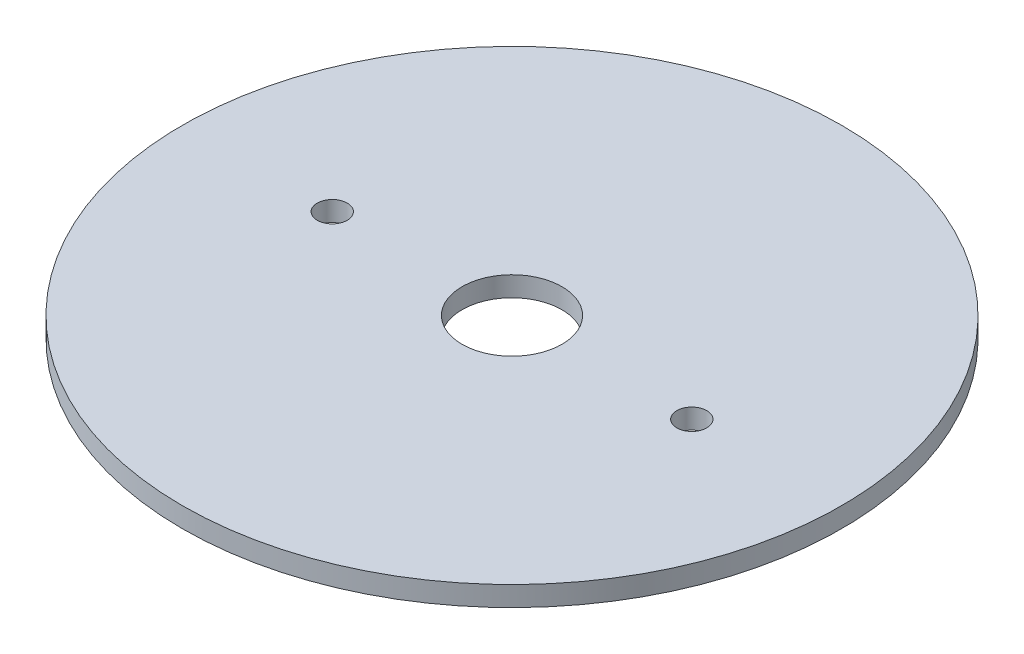
ISO-10303-21;
HEADER;
FILE_DESCRIPTION(('STEP AP214'),'2;1');
FILE_NAME('part.step','',(''),(''),'','','');
FILE_SCHEMA(('AUTOMOTIVE_DESIGN { 1 0 10303 214 1 1 1 1 }'));
ENDSEC;
DATA;
#1=APPLICATION_CONTEXT('core data for automotive mechanical design processes');
#2=APPLICATION_PROTOCOL_DEFINITION('international standard','automotive_design',2000,#1);
#3=PRODUCT_CONTEXT('',#1,'mechanical');
#4=PRODUCT('Part','Part','',(#3));
#5=PRODUCT_RELATED_PRODUCT_CATEGORY('part','',(#4));
#6=PRODUCT_DEFINITION_FORMATION('','',#4);
#7=PRODUCT_DEFINITION_CONTEXT('part definition',#1,'design');
#8=PRODUCT_DEFINITION('design','',#6,#7);
#9=PRODUCT_DEFINITION_SHAPE('','',#8);
#10=(LENGTH_UNIT() NAMED_UNIT(*) SI_UNIT(.MILLI.,.METRE.));
#11=(NAMED_UNIT(*) PLANE_ANGLE_UNIT() SI_UNIT($,.RADIAN.));
#12=(NAMED_UNIT(*) SI_UNIT($,.STERADIAN.) SOLID_ANGLE_UNIT());
#13=UNCERTAINTY_MEASURE_WITH_UNIT(LENGTH_MEASURE(1.E-05),#10,'distance_accuracy_value','');
#14=(GEOMETRIC_REPRESENTATION_CONTEXT(3) GLOBAL_UNCERTAINTY_ASSIGNED_CONTEXT((#13)) GLOBAL_UNIT_ASSIGNED_CONTEXT((#10,
#11,#12)) REPRESENTATION_CONTEXT('',''));
#15=CARTESIAN_POINT('',(0.,0.,0.));
#16=DIRECTION('',(0.,0.,1.));
#17=DIRECTION('',(1.,0.,0.));
#18=AXIS2_PLACEMENT_3D('',#15,#16,#17);
#19=CARTESIAN_POINT('',(0.,2.,0.));
#20=DIRECTION('',(0.,1.,0.));
#21=DIRECTION('',(0.,0.,1.));
#22=AXIS2_PLACEMENT_3D('',#19,#20,#21);
#23=PLANE('',#22);
#24=CARTESIAN_POINT('',(18.,2.,0.));
#25=DIRECTION('',(0.,1.,0.));
#26=DIRECTION('',(0.,0.,1.));
#27=AXIS2_PLACEMENT_3D('',#24,#25,#26);
#28=CIRCLE('',#27,1.5);
#29=CARTESIAN_POINT('',(18.,2.,1.5));
#30=VERTEX_POINT('',#29);
#31=EDGE_CURVE('E47',#30,#30,#28,.T.);
#32=ORIENTED_EDGE('',*,*,#31,.F.);
#33=EDGE_LOOP('',(#32));
#34=FACE_BOUND('',#33,.T.);
#35=CARTESIAN_POINT('',(0.,2.,0.));
#36=DIRECTION('',(0.,1.,0.));
#37=DIRECTION('',(0.,0.,1.));
#38=AXIS2_PLACEMENT_3D('',#35,#36,#37);
#39=CIRCLE('',#38,33.);
#40=CARTESIAN_POINT('',(0.,2.,33.));
#41=VERTEX_POINT('',#40);
#42=EDGE_CURVE('E10',#41,#41,#39,.T.);
#43=ORIENTED_EDGE('',*,*,#42,.T.);
#44=EDGE_LOOP('',(#43));
#45=FACE_BOUND('',#44,.T.);
#46=CARTESIAN_POINT('',(0.,2.,0.));
#47=DIRECTION('',(0.,1.,0.));
#48=DIRECTION('',(0.,0.,1.));
#49=AXIS2_PLACEMENT_3D('',#46,#47,#48);
#50=CIRCLE('',#49,5.);
#51=CARTESIAN_POINT('',(0.,2.,5.));
#52=VERTEX_POINT('',#51);
#53=EDGE_CURVE('E42',#52,#52,#50,.T.);
#54=ORIENTED_EDGE('',*,*,#53,.F.);
#55=EDGE_LOOP('',(#54));
#56=FACE_BOUND('',#55,.T.);
#57=CARTESIAN_POINT('',(-18.,2.,0.));
#58=DIRECTION('',(0.,1.,0.));
#59=DIRECTION('',(0.,0.,1.));
#60=AXIS2_PLACEMENT_3D('',#57,#58,#59);
#61=CIRCLE('',#60,1.5);
#62=CARTESIAN_POINT('',(-18.,2.,1.5));
#63=VERTEX_POINT('',#62);
#64=EDGE_CURVE('E53',#63,#63,#61,.T.);
#65=ORIENTED_EDGE('',*,*,#64,.F.);
#66=EDGE_LOOP('',(#65));
#67=FACE_BOUND('',#66,.T.);
#68=ADVANCED_FACE('F31',(#34,#45,#56,#67),#23,.T.);
#69=CARTESIAN_POINT('',(0.,0.,0.));
#70=DIRECTION('',(0.,1.,0.));
#71=DIRECTION('',(0.,0.,1.));
#72=AXIS2_PLACEMENT_3D('',#69,#70,#71);
#73=PLANE('',#72);
#74=CARTESIAN_POINT('',(0.,0.,0.));
#75=DIRECTION('',(0.,1.,0.));
#76=DIRECTION('',(0.,0.,1.));
#77=AXIS2_PLACEMENT_3D('',#74,#75,#76);
#78=CIRCLE('',#77,33.);
#79=CARTESIAN_POINT('',(0.,0.,33.));
#80=VERTEX_POINT('',#79);
#81=EDGE_CURVE('E35',#80,#80,#78,.T.);
#82=ORIENTED_EDGE('',*,*,#81,.F.);
#83=EDGE_LOOP('',(#82));
#84=FACE_BOUND('',#83,.T.);
#85=CARTESIAN_POINT('',(0.,0.,0.));
#86=DIRECTION('',(0.,1.,0.));
#87=DIRECTION('',(0.,0.,1.));
#88=AXIS2_PLACEMENT_3D('',#85,#86,#87);
#89=CIRCLE('',#88,5.);
#90=CARTESIAN_POINT('',(0.,0.,5.));
#91=VERTEX_POINT('',#90);
#92=EDGE_CURVE('E44',#91,#91,#89,.T.);
#93=ORIENTED_EDGE('',*,*,#92,.T.);
#94=EDGE_LOOP('',(#93));
#95=FACE_BOUND('',#94,.T.);
#96=CARTESIAN_POINT('',(18.,0.,0.));
#97=DIRECTION('',(0.,1.,0.));
#98=DIRECTION('',(0.,0.,1.));
#99=AXIS2_PLACEMENT_3D('',#96,#97,#98);
#100=CIRCLE('',#99,1.5);
#101=CARTESIAN_POINT('',(18.,0.,1.5));
#102=VERTEX_POINT('',#101);
#103=EDGE_CURVE('E50',#102,#102,#100,.T.);
#104=ORIENTED_EDGE('',*,*,#103,.T.);
#105=EDGE_LOOP('',(#104));
#106=FACE_BOUND('',#105,.T.);
#107=CARTESIAN_POINT('',(-18.,0.,0.));
#108=DIRECTION('',(0.,1.,0.));
#109=DIRECTION('',(0.,0.,1.));
#110=AXIS2_PLACEMENT_3D('',#107,#108,#109);
#111=CIRCLE('',#110,1.5);
#112=CARTESIAN_POINT('',(-18.,0.,1.5));
#113=VERTEX_POINT('',#112);
#114=EDGE_CURVE('E56',#113,#113,#111,.T.);
#115=ORIENTED_EDGE('',*,*,#114,.T.);
#116=EDGE_LOOP('',(#115));
#117=FACE_BOUND('',#116,.T.);
#118=ADVANCED_FACE('F66',(#84,#95,#106,#117),#73,.F.);
#119=CARTESIAN_POINT('',(0.,2.,0.));
#120=DIRECTION('',(0.,-1.,0.));
#121=DIRECTION('',(0.,0.,-1.));
#122=AXIS2_PLACEMENT_3D('',#119,#120,#121);
#123=CYLINDRICAL_SURFACE('',#122,33.);
#124=ORIENTED_EDGE('',*,*,#42,.F.);
#125=EDGE_LOOP('',(#124));
#126=FACE_BOUND('',#125,.T.);
#127=ORIENTED_EDGE('',*,*,#81,.T.);
#128=EDGE_LOOP('',(#127));
#129=FACE_BOUND('',#128,.T.);
#130=ADVANCED_FACE('F33',(#126,#129),#123,.T.);
#131=CARTESIAN_POINT('',(0.,2.,0.));
#132=DIRECTION('',(0.,-1.,0.));
#133=DIRECTION('',(0.,0.,-1.));
#134=AXIS2_PLACEMENT_3D('',#131,#132,#133);
#135=CYLINDRICAL_SURFACE('',#134,5.);
#136=ORIENTED_EDGE('',*,*,#53,.T.);
#137=EDGE_LOOP('',(#136));
#138=FACE_BOUND('',#137,.T.);
#139=ORIENTED_EDGE('',*,*,#92,.F.);
#140=EDGE_LOOP('',(#139));
#141=FACE_BOUND('',#140,.T.);
#142=ADVANCED_FACE('F75',(#138,#141),#135,.F.);
#143=CARTESIAN_POINT('',(18.,2.,0.));
#144=DIRECTION('',(0.,-1.,0.));
#145=DIRECTION('',(0.,0.,-1.));
#146=AXIS2_PLACEMENT_3D('',#143,#144,#145);
#147=CYLINDRICAL_SURFACE('',#146,1.5);
#148=ORIENTED_EDGE('',*,*,#31,.T.);
#149=EDGE_LOOP('',(#148));
#150=FACE_BOUND('',#149,.T.);
#151=ORIENTED_EDGE('',*,*,#103,.F.);
#152=EDGE_LOOP('',(#151));
#153=FACE_BOUND('',#152,.T.);
#154=ADVANCED_FACE('F78',(#150,#153),#147,.F.);
#155=CARTESIAN_POINT('',(-18.,2.,0.));
#156=DIRECTION('',(0.,-1.,0.));
#157=DIRECTION('',(0.,0.,-1.));
#158=AXIS2_PLACEMENT_3D('',#155,#156,#157);
#159=CYLINDRICAL_SURFACE('',#158,1.5);
#160=ORIENTED_EDGE('',*,*,#64,.T.);
#161=EDGE_LOOP('',(#160));
#162=FACE_BOUND('',#161,.T.);
#163=ORIENTED_EDGE('',*,*,#114,.F.);
#164=EDGE_LOOP('',(#163));
#165=FACE_BOUND('',#164,.T.);
#166=ADVANCED_FACE('F62',(#162,#165),#159,.F.);
#167=CLOSED_SHELL('',(#68,#118,#130,#142,#154,#166));
#168=MANIFOLD_SOLID_BREP('B2',#167);
#169=ADVANCED_BREP_SHAPE_REPRESENTATION('',(#18,#168),#14);
#170=SHAPE_DEFINITION_REPRESENTATION(#9,#169);
ENDSEC;
END-ISO-10303-21;
